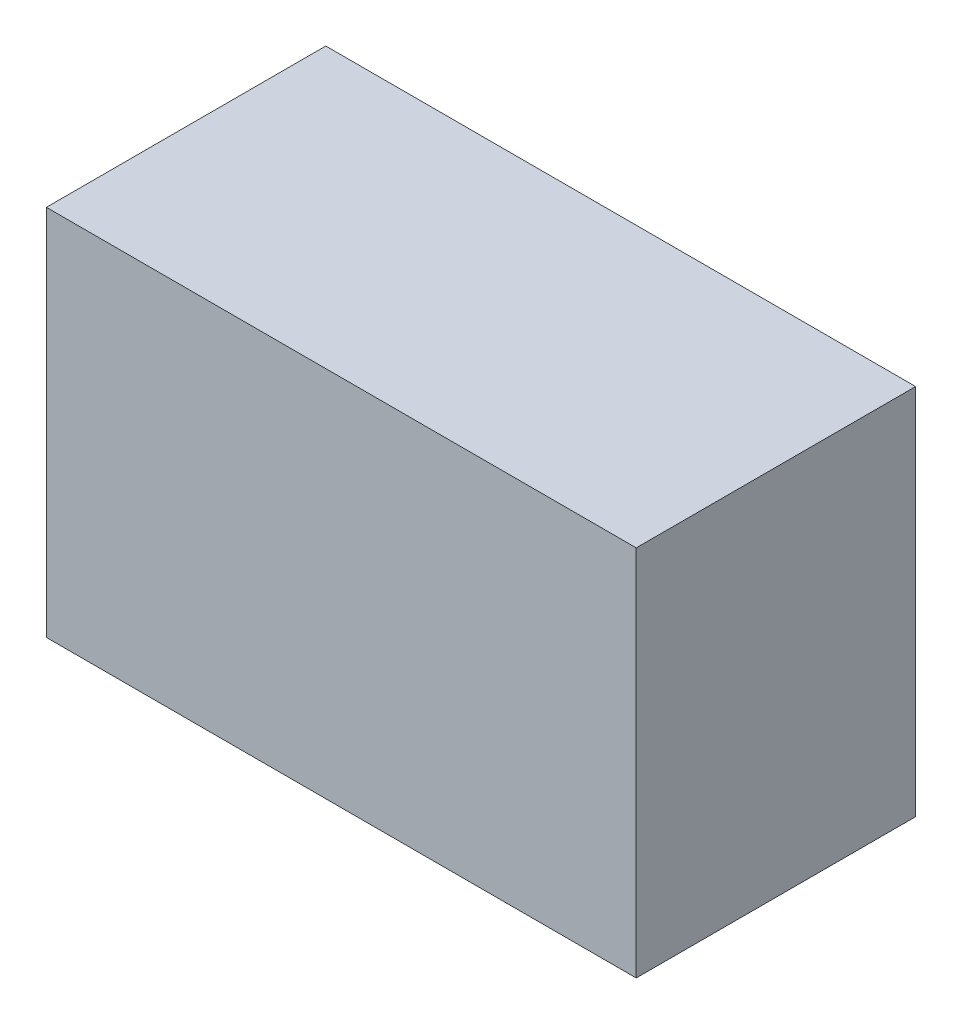
ISO-10303-21;
HEADER;
FILE_DESCRIPTION(('STEP AP214'),'2;1');
FILE_NAME('part.step','',(''),(''),'','','');
FILE_SCHEMA(('AUTOMOTIVE_DESIGN { 1 0 10303 214 1 1 1 1 }'));
ENDSEC;
DATA;
#1=APPLICATION_CONTEXT('core data for automotive mechanical design processes');
#2=APPLICATION_PROTOCOL_DEFINITION('international standard','automotive_design',2000,#1);
#3=PRODUCT_CONTEXT('',#1,'mechanical');
#4=PRODUCT('Part','Part','',(#3));
#5=PRODUCT_RELATED_PRODUCT_CATEGORY('part','',(#4));
#6=PRODUCT_DEFINITION_FORMATION('','',#4);
#7=PRODUCT_DEFINITION_CONTEXT('part definition',#1,'design');
#8=PRODUCT_DEFINITION('design','',#6,#7);
#9=PRODUCT_DEFINITION_SHAPE('','',#8);
#10=(LENGTH_UNIT() NAMED_UNIT(*) SI_UNIT(.MILLI.,.METRE.));
#11=(NAMED_UNIT(*) PLANE_ANGLE_UNIT() SI_UNIT($,.RADIAN.));
#12=(NAMED_UNIT(*) SI_UNIT($,.STERADIAN.) SOLID_ANGLE_UNIT());
#13=UNCERTAINTY_MEASURE_WITH_UNIT(LENGTH_MEASURE(1.E-05),#10,'distance_accuracy_value','');
#14=(GEOMETRIC_REPRESENTATION_CONTEXT(3) GLOBAL_UNCERTAINTY_ASSIGNED_CONTEXT((#13)) GLOBAL_UNIT_ASSIGNED_CONTEXT((#10,
#11,#12)) REPRESENTATION_CONTEXT('',''));
#15=CARTESIAN_POINT('',(0.,0.,0.));
#16=DIRECTION('',(0.,0.,1.));
#17=DIRECTION('',(1.,0.,0.));
#18=AXIS2_PLACEMENT_3D('',#15,#16,#17);
#19=CARTESIAN_POINT('',(-1.42499842,0.90000074,1.34999984));
#20=DIRECTION('',(0.,0.,-1.));
#21=DIRECTION('',(-1.,0.,0.));
#22=AXIS2_PLACEMENT_3D('',#19,#20,#21);
#23=PLANE('',#22);
#24=DIRECTION('',(1.,0.,0.));
#25=VECTOR('',#24,1.);
#26=CARTESIAN_POINT('',(-1.42499842,-0.90000074,1.34999984));
#27=LINE('',#26,#25);
#28=CARTESIAN_POINT('',(-1.42499842,-0.90000074,1.34999984));
#29=VERTEX_POINT('',#28);
#30=CARTESIAN_POINT('',(1.42500096,-0.90000074,1.34999984));
#31=VERTEX_POINT('',#30);
#32=EDGE_CURVE('E55',#29,#31,#27,.T.);
#33=ORIENTED_EDGE('',*,*,#32,.T.);
#34=DIRECTION('',(0.,1.,0.));
#35=VECTOR('',#34,1.);
#36=CARTESIAN_POINT('',(1.42500096,-0.90000074,1.34999984));
#37=LINE('',#36,#35);
#38=CARTESIAN_POINT('',(1.42500096,0.90000074,1.34999984));
#39=VERTEX_POINT('',#38);
#40=EDGE_CURVE('E57',#31,#39,#37,.T.);
#41=ORIENTED_EDGE('',*,*,#40,.T.);
#42=DIRECTION('',(1.,0.,0.));
#43=VECTOR('',#42,1.);
#44=CARTESIAN_POINT('',(1.42500096,0.90000074,1.34999984));
#45=LINE('',#44,#43);
#46=CARTESIAN_POINT('',(-1.42499842,0.90000074,1.34999984));
#47=VERTEX_POINT('',#46);
#48=EDGE_CURVE('E20',#39,#47,#45,.F.);
#49=ORIENTED_EDGE('',*,*,#48,.T.);
#50=DIRECTION('',(0.,1.,0.));
#51=VECTOR('',#50,1.);
#52=CARTESIAN_POINT('',(-1.42499842,0.90000074,1.34999984));
#53=LINE('',#52,#51);
#54=EDGE_CURVE('E80',#47,#29,#53,.F.);
#55=ORIENTED_EDGE('',*,*,#54,.T.);
#56=EDGE_LOOP('',(#33,#41,#49,#55));
#57=FACE_BOUND('',#56,.T.);
#58=ADVANCED_FACE('F17',(#57),#23,.F.);
#59=CARTESIAN_POINT('',(1.42500096,0.90000074,0.));
#60=DIRECTION('',(0.,-1.,0.));
#61=DIRECTION('',(0.,0.,-1.));
#62=AXIS2_PLACEMENT_3D('',#59,#60,#61);
#63=PLANE('',#62);
#64=DIRECTION('',(0.,0.,-1.));
#65=VECTOR('',#64,1.);
#66=CARTESIAN_POINT('',(-1.42499842,0.90000074,0.));
#67=LINE('',#66,#65);
#68=CARTESIAN_POINT('',(-1.42499842,0.90000074,0.));
#69=VERTEX_POINT('',#68);
#70=EDGE_CURVE('E68',#69,#47,#67,.F.);
#71=ORIENTED_EDGE('',*,*,#70,.T.);
#72=ORIENTED_EDGE('',*,*,#48,.F.);
#73=DIRECTION('',(0.,0.,1.));
#74=VECTOR('',#73,1.);
#75=CARTESIAN_POINT('',(1.42500096,0.90000074,0.));
#76=LINE('',#75,#74);
#77=CARTESIAN_POINT('',(1.42500096,0.90000074,0.));
#78=VERTEX_POINT('',#77);
#79=EDGE_CURVE('E63',#39,#78,#76,.F.);
#80=ORIENTED_EDGE('',*,*,#79,.T.);
#81=DIRECTION('',(-1.,0.,0.));
#82=VECTOR('',#81,1.);
#83=CARTESIAN_POINT('',(-1.42499842,0.90000074,0.));
#84=LINE('',#83,#82);
#85=EDGE_CURVE('E83',#69,#78,#84,.F.);
#86=ORIENTED_EDGE('',*,*,#85,.F.);
#87=EDGE_LOOP('',(#71,#72,#80,#86));
#88=FACE_BOUND('',#87,.T.);
#89=ADVANCED_FACE('F65',(#88),#63,.F.);
#90=CARTESIAN_POINT('',(1.42500096,-0.90000074,0.));
#91=DIRECTION('',(-1.,0.,0.));
#92=DIRECTION('',(0.,0.,1.));
#93=AXIS2_PLACEMENT_3D('',#90,#91,#92);
#94=PLANE('',#93);
#95=ORIENTED_EDGE('',*,*,#79,.F.);
#96=ORIENTED_EDGE('',*,*,#40,.F.);
#97=DIRECTION('',(0.,0.,1.));
#98=VECTOR('',#97,1.);
#99=CARTESIAN_POINT('',(1.42500096,-0.90000074,0.));
#100=LINE('',#99,#98);
#101=CARTESIAN_POINT('',(1.42500096,-0.90000074,0.));
#102=VERTEX_POINT('',#101);
#103=EDGE_CURVE('E75',#31,#102,#100,.F.);
#104=ORIENTED_EDGE('',*,*,#103,.T.);
#105=DIRECTION('',(0.,1.,0.));
#106=VECTOR('',#105,1.);
#107=CARTESIAN_POINT('',(1.42500096,0.90000074,0.));
#108=LINE('',#107,#106);
#109=EDGE_CURVE('E72',#78,#102,#108,.F.);
#110=ORIENTED_EDGE('',*,*,#109,.F.);
#111=EDGE_LOOP('',(#95,#96,#104,#110));
#112=FACE_BOUND('',#111,.T.);
#113=ADVANCED_FACE('F70',(#112),#94,.F.);
#114=CARTESIAN_POINT('',(-1.42499842,-0.90000074,0.));
#115=DIRECTION('',(0.,1.,0.));
#116=DIRECTION('',(0.,0.,1.));
#117=AXIS2_PLACEMENT_3D('',#114,#115,#116);
#118=PLANE('',#117);
#119=ORIENTED_EDGE('',*,*,#103,.F.);
#120=ORIENTED_EDGE('',*,*,#32,.F.);
#121=DIRECTION('',(0.,0.,-1.));
#122=VECTOR('',#121,1.);
#123=CARTESIAN_POINT('',(-1.42499842,-0.90000074,0.));
#124=LINE('',#123,#122);
#125=CARTESIAN_POINT('',(-1.42499842,-0.90000074,0.));
#126=VERTEX_POINT('',#125);
#127=EDGE_CURVE('E35',#29,#126,#124,.T.);
#128=ORIENTED_EDGE('',*,*,#127,.T.);
#129=DIRECTION('',(-1.,0.,0.));
#130=VECTOR('',#129,1.);
#131=CARTESIAN_POINT('',(-1.42499842,-0.90000074,0.));
#132=LINE('',#131,#130);
#133=EDGE_CURVE('E26',#102,#126,#132,.T.);
#134=ORIENTED_EDGE('',*,*,#133,.F.);
#135=EDGE_LOOP('',(#119,#120,#128,#134));
#136=FACE_BOUND('',#135,.T.);
#137=ADVANCED_FACE('F89',(#136),#118,.F.);
#138=CARTESIAN_POINT('',(-1.42499842,0.90000074,0.));
#139=DIRECTION('',(1.,0.,0.));
#140=DIRECTION('',(0.,0.,-1.));
#141=AXIS2_PLACEMENT_3D('',#138,#139,#140);
#142=PLANE('',#141);
#143=ORIENTED_EDGE('',*,*,#127,.F.);
#144=ORIENTED_EDGE('',*,*,#54,.F.);
#145=ORIENTED_EDGE('',*,*,#70,.F.);
#146=DIRECTION('',(0.,1.,0.));
#147=VECTOR('',#146,1.);
#148=CARTESIAN_POINT('',(-1.42499842,0.90000074,0.));
#149=LINE('',#148,#147);
#150=EDGE_CURVE('E11',#126,#69,#149,.T.);
#151=ORIENTED_EDGE('',*,*,#150,.F.);
#152=EDGE_LOOP('',(#143,#144,#145,#151));
#153=FACE_BOUND('',#152,.T.);
#154=ADVANCED_FACE('F91',(#153),#142,.F.);
#155=CARTESIAN_POINT('',(-1.42499842,0.90000074,0.));
#156=DIRECTION('',(0.,0.,-1.));
#157=DIRECTION('',(-1.,0.,0.));
#158=AXIS2_PLACEMENT_3D('',#155,#156,#157);
#159=PLANE('',#158);
#160=ORIENTED_EDGE('',*,*,#133,.T.);
#161=ORIENTED_EDGE('',*,*,#150,.T.);
#162=ORIENTED_EDGE('',*,*,#85,.T.);
#163=ORIENTED_EDGE('',*,*,#109,.T.);
#164=EDGE_LOOP('',(#160,#161,#162,#163));
#165=FACE_BOUND('',#164,.T.);
#166=ADVANCED_FACE('F88',(#165),#159,.T.);
#167=CLOSED_SHELL('',(#58,#89,#113,#137,#154,#166));
#168=MANIFOLD_SOLID_BREP('B1',#167);
#169=ADVANCED_BREP_SHAPE_REPRESENTATION('',(#18,#168),#14);
#170=SHAPE_DEFINITION_REPRESENTATION(#9,#169);
ENDSEC;
END-ISO-10303-21;
